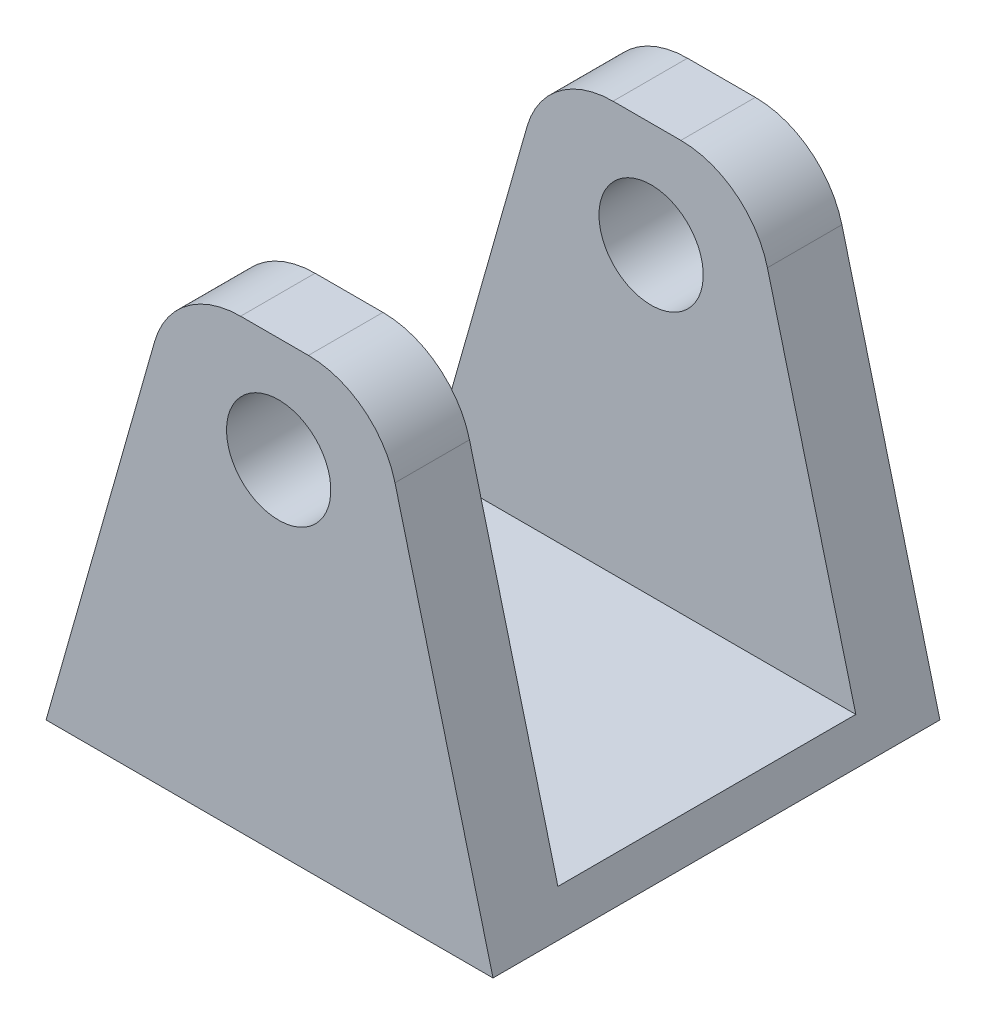
ISO-10303-21;
HEADER;
FILE_DESCRIPTION(('STEP AP214'),'2;1');
FILE_NAME('part.step','',(''),(''),'','','');
FILE_SCHEMA(('AUTOMOTIVE_DESIGN { 1 0 10303 214 1 1 1 1 }'));
ENDSEC;
DATA;
#1=APPLICATION_CONTEXT('core data for automotive mechanical design processes');
#2=APPLICATION_PROTOCOL_DEFINITION('international standard','automotive_design',2000,#1);
#3=PRODUCT_CONTEXT('',#1,'mechanical');
#4=PRODUCT('Part','Part','',(#3));
#5=PRODUCT_RELATED_PRODUCT_CATEGORY('part','',(#4));
#6=PRODUCT_DEFINITION_FORMATION('','',#4);
#7=PRODUCT_DEFINITION_CONTEXT('part definition',#1,'design');
#8=PRODUCT_DEFINITION('design','',#6,#7);
#9=PRODUCT_DEFINITION_SHAPE('','',#8);
#10=(LENGTH_UNIT() NAMED_UNIT(*) SI_UNIT(.MILLI.,.METRE.));
#11=(NAMED_UNIT(*) PLANE_ANGLE_UNIT() SI_UNIT($,.RADIAN.));
#12=(NAMED_UNIT(*) SI_UNIT($,.STERADIAN.) SOLID_ANGLE_UNIT());
#13=UNCERTAINTY_MEASURE_WITH_UNIT(LENGTH_MEASURE(1.E-05),#10,'distance_accuracy_value','');
#14=(GEOMETRIC_REPRESENTATION_CONTEXT(3) GLOBAL_UNCERTAINTY_ASSIGNED_CONTEXT((#13)) GLOBAL_UNIT_ASSIGNED_CONTEXT((#10,
#11,#12)) REPRESENTATION_CONTEXT('',''));
#15=CARTESIAN_POINT('',(0.,0.,0.));
#16=DIRECTION('',(0.,0.,1.));
#17=DIRECTION('',(1.,0.,0.));
#18=AXIS2_PLACEMENT_3D('',#15,#16,#17);
#19=CARTESIAN_POINT('',(-14.7779533941251,41.3214103307345,60.));
#20=DIRECTION('',(0.,0.,-1.));
#21=DIRECTION('',(-1.,0.,0.));
#22=AXIS2_PLACEMENT_3D('',#19,#20,#21);
#23=CYLINDRICAL_SURFACE('',#22,12.);
#24=DIRECTION('',(0.,0.,-1.));
#25=VECTOR('',#24,1.);
#26=CARTESIAN_POINT('',(-14.7779533941251,53.3214103307345,60.));
#27=LINE('',#26,#25);
#28=CARTESIAN_POINT('',(-14.7779533941251,53.3214103307345,9.99999999999999));
#29=VERTEX_POINT('',#28);
#30=CARTESIAN_POINT('',(-14.7779533941251,53.3214103307345,0.));
#31=VERTEX_POINT('',#30);
#32=EDGE_CURVE('E156',#29,#31,#27,.T.);
#33=ORIENTED_EDGE('',*,*,#32,.F.);
#34=CARTESIAN_POINT('',(-14.7779533941251,41.3214103307345,9.99999999999999));
#35=DIRECTION('',(0.,0.,-1.));
#36=DIRECTION('',(0.,1.,0.));
#37=AXIS2_PLACEMENT_3D('',#34,#35,#36);
#38=CIRCLE('',#37,12.);
#39=CARTESIAN_POINT('',(-3.15849944270205,44.3194580072666,9.99999999999999));
#40=VERTEX_POINT('',#39);
#41=EDGE_CURVE('E213',#29,#40,#38,.T.);
#42=ORIENTED_EDGE('',*,*,#41,.T.);
#43=DIRECTION('',(0.,0.,-1.));
#44=VECTOR('',#43,1.);
#45=CARTESIAN_POINT('',(-3.15849944270205,44.3194580072666,60.));
#46=LINE('',#45,#44);
#47=CARTESIAN_POINT('',(-3.15849944270205,44.3194580072666,0.));
#48=VERTEX_POINT('',#47);
#49=EDGE_CURVE('E160',#40,#48,#46,.T.);
#50=ORIENTED_EDGE('',*,*,#49,.T.);
#51=CARTESIAN_POINT('',(-14.7779533941251,41.3214103307345,0.));
#52=DIRECTION('',(0.,0.,1.));
#53=DIRECTION('',(-1.,0.,0.));
#54=AXIS2_PLACEMENT_3D('',#51,#52,#53);
#55=CIRCLE('',#54,12.);
#56=EDGE_CURVE('E138',#48,#31,#55,.T.);
#57=ORIENTED_EDGE('',*,*,#56,.T.);
#58=EDGE_LOOP('',(#33,#42,#50,#57));
#59=FACE_BOUND('',#58,.T.);
#60=ADVANCED_FACE('F33',(#59),#23,.T.);
#61=CARTESIAN_POINT('',(-14.7779533941251,53.3214103307345,60.));
#62=DIRECTION('',(0.,-1.,0.));
#63=DIRECTION('',(1.,0.,0.));
#64=AXIS2_PLACEMENT_3D('',#61,#62,#63);
#65=PLANE('',#64);
#66=DIRECTION('',(0.,0.,-1.));
#67=VECTOR('',#66,1.);
#68=CARTESIAN_POINT('',(-23.887487956644,53.3214103307345,60.));
#69=LINE('',#68,#67);
#70=CARTESIAN_POINT('',(-23.887487956644,53.3214103307345,10.));
#71=VERTEX_POINT('',#70);
#72=CARTESIAN_POINT('',(-23.887487956644,53.3214103307345,0.));
#73=VERTEX_POINT('',#72);
#74=EDGE_CURVE('E124',#71,#73,#69,.T.);
#75=ORIENTED_EDGE('',*,*,#74,.F.);
#76=DIRECTION('',(1.,0.,0.));
#77=VECTOR('',#76,1.);
#78=CARTESIAN_POINT('',(-14.7779533941251,53.3214103307345,9.99999999999999));
#79=LINE('',#78,#77);
#80=EDGE_CURVE('E210',#71,#29,#79,.T.);
#81=ORIENTED_EDGE('',*,*,#80,.T.);
#82=ORIENTED_EDGE('',*,*,#32,.T.);
#83=DIRECTION('',(-1.,0.,0.));
#84=VECTOR('',#83,1.);
#85=CARTESIAN_POINT('',(-14.7779533941251,53.3214103307345,0.));
#86=LINE('',#85,#84);
#87=EDGE_CURVE('E142',#31,#73,#86,.T.);
#88=ORIENTED_EDGE('',*,*,#87,.T.);
#89=EDGE_LOOP('',(#75,#81,#82,#88));
#90=FACE_BOUND('',#89,.T.);
#91=ADVANCED_FACE('F262',(#90),#65,.F.);
#92=CARTESIAN_POINT('',(-23.887487956644,41.3214103307345,60.));
#93=DIRECTION('',(0.,0.,-1.));
#94=DIRECTION('',(-1.,0.,0.));
#95=AXIS2_PLACEMENT_3D('',#92,#93,#94);
#96=CYLINDRICAL_SURFACE('',#95,12.);
#97=DIRECTION('',(0.,0.,-1.));
#98=VECTOR('',#97,1.);
#99=CARTESIAN_POINT('',(-35.4306354549265,44.6010057071331,60.));
#100=LINE('',#99,#98);
#101=CARTESIAN_POINT('',(-35.4306354549265,44.6010057071331,9.99999999999999));
#102=VERTEX_POINT('',#101);
#103=CARTESIAN_POINT('',(-35.4306354549265,44.6010057071331,0.));
#104=VERTEX_POINT('',#103);
#105=EDGE_CURVE('E125',#102,#104,#100,.T.);
#106=ORIENTED_EDGE('',*,*,#105,.F.);
#107=CARTESIAN_POINT('',(-23.887487956644,41.3214103307345,9.99999999999999));
#108=DIRECTION('',(0.,0.,-1.));
#109=DIRECTION('',(0.,1.,0.));
#110=AXIS2_PLACEMENT_3D('',#107,#108,#109);
#111=CIRCLE('',#110,12.);
#112=EDGE_CURVE('E207',#102,#71,#111,.T.);
#113=ORIENTED_EDGE('',*,*,#112,.T.);
#114=ORIENTED_EDGE('',*,*,#74,.T.);
#115=CARTESIAN_POINT('',(-23.887487956644,41.3214103307345,0.));
#116=DIRECTION('',(0.,0.,1.));
#117=DIRECTION('',(1.,0.,0.));
#118=AXIS2_PLACEMENT_3D('',#115,#116,#117);
#119=CIRCLE('',#118,12.);
#120=EDGE_CURVE('E145',#73,#104,#119,.T.);
#121=ORIENTED_EDGE('',*,*,#120,.T.);
#122=EDGE_LOOP('',(#106,#113,#114,#121));
#123=FACE_BOUND('',#122,.T.);
#124=ADVANCED_FACE('F264',(#123),#96,.T.);
#125=CARTESIAN_POINT('',(-18.7763510848294,39.1607245698293,60.));
#126=DIRECTION('',(0.,0.,-1.));
#127=DIRECTION('',(-1.,0.,0.));
#128=AXIS2_PLACEMENT_3D('',#125,#126,#127);
#129=CYLINDRICAL_SURFACE('',#128,7.);
#130=CARTESIAN_POINT('',(-18.7763510848294,39.1607245698293,9.99999999999999));
#131=DIRECTION('',(0.,0.,-1.));
#132=DIRECTION('',(0.,1.,0.));
#133=AXIS2_PLACEMENT_3D('',#130,#131,#132);
#134=CIRCLE('',#133,7.);
#135=CARTESIAN_POINT('',(-25.7763510848294,39.1607245698293,9.99999999999999));
#136=VERTEX_POINT('',#135);
#137=EDGE_CURVE('E168',#136,#136,#134,.T.);
#138=CARTESIAN_POINT('',(-18.7763510848294,39.1607245698293,0.));
#139=DIRECTION('',(0.,0.,1.));
#140=DIRECTION('',(1.,0.,0.));
#141=AXIS2_PLACEMENT_3D('',#138,#139,#140);
#142=CIRCLE('',#141,7.);
#143=CARTESIAN_POINT('',(-25.7763510848294,39.1607245698293,0.));
#144=VERTEX_POINT('',#143);
#145=EDGE_CURVE('E219',#144,#144,#142,.T.);
#146=CARTESIAN_POINT('',(-25.7763510848294,39.1607245698293,9.99999999999999));
#147=CARTESIAN_POINT('',(-25.7763510848294,39.1607245698293,9.89583333333333));
#148=CARTESIAN_POINT('',(-25.7763510848294,39.1607245698293,9.79166666666666));
#149=CARTESIAN_POINT('',(-25.7763510848294,39.1607245698293,9.58333333333333));
#150=CARTESIAN_POINT('',(-25.7763510848294,39.1607245698293,9.47916666666666));
#151=CARTESIAN_POINT('',(-25.7763510848294,39.1607245698293,9.27083333333333));
#152=CARTESIAN_POINT('',(-25.7763510848294,39.1607245698293,9.16666666666666));
#153=CARTESIAN_POINT('',(-25.7763510848294,39.1607245698293,8.95833333333333));
#154=CARTESIAN_POINT('',(-25.7763510848294,39.1607245698293,8.85416666666666));
#155=CARTESIAN_POINT('',(-25.7763510848294,39.1607245698293,8.64583333333333));
#156=CARTESIAN_POINT('',(-25.7763510848294,39.1607245698293,8.54166666666666));
#157=CARTESIAN_POINT('',(-25.7763510848294,39.1607245698293,8.33333333333333));
#158=CARTESIAN_POINT('',(-25.7763510848294,39.1607245698293,8.22916666666666));
#159=CARTESIAN_POINT('',(-25.7763510848294,39.1607245698293,8.02083333333333));
#160=CARTESIAN_POINT('',(-25.7763510848294,39.1607245698293,7.91666666666666));
#161=CARTESIAN_POINT('',(-25.7763510848294,39.1607245698293,7.70833333333333));
#162=CARTESIAN_POINT('',(-25.7763510848294,39.1607245698293,7.60416666666666));
#163=CARTESIAN_POINT('',(-25.7763510848294,39.1607245698293,7.39583333333333));
#164=CARTESIAN_POINT('',(-25.7763510848294,39.1607245698293,7.29166666666666));
#165=CARTESIAN_POINT('',(-25.7763510848294,39.1607245698293,7.08333333333333));
#166=CARTESIAN_POINT('',(-25.7763510848294,39.1607245698293,6.97916666666667));
#167=CARTESIAN_POINT('',(-25.7763510848294,39.1607245698293,6.77083333333333));
#168=CARTESIAN_POINT('',(-25.7763510848294,39.1607245698293,6.66666666666667));
#169=CARTESIAN_POINT('',(-25.7763510848294,39.1607245698293,6.45833333333333));
#170=CARTESIAN_POINT('',(-25.7763510848294,39.1607245698293,6.35416666666667));
#171=CARTESIAN_POINT('',(-25.7763510848294,39.1607245698293,6.14583333333333));
#172=CARTESIAN_POINT('',(-25.7763510848294,39.1607245698293,6.04166666666667));
#173=CARTESIAN_POINT('',(-25.7763510848294,39.1607245698293,5.83333333333333));
#174=CARTESIAN_POINT('',(-25.7763510848294,39.1607245698293,5.72916666666666));
#175=CARTESIAN_POINT('',(-25.7763510848294,39.1607245698293,5.52083333333333));
#176=CARTESIAN_POINT('',(-25.7763510848294,39.1607245698293,5.41666666666666));
#177=CARTESIAN_POINT('',(-25.7763510848294,39.1607245698293,5.20833333333333));
#178=CARTESIAN_POINT('',(-25.7763510848294,39.1607245698293,5.10416666666666));
#179=CARTESIAN_POINT('',(-25.7763510848294,39.1607245698293,4.89583333333333));
#180=CARTESIAN_POINT('',(-25.7763510848294,39.1607245698293,4.79166666666666));
#181=CARTESIAN_POINT('',(-25.7763510848294,39.1607245698293,4.58333333333333));
#182=CARTESIAN_POINT('',(-25.7763510848294,39.1607245698293,4.47916666666666));
#183=CARTESIAN_POINT('',(-25.7763510848294,39.1607245698293,4.27083333333333));
#184=CARTESIAN_POINT('',(-25.7763510848294,39.1607245698293,4.16666666666666));
#185=CARTESIAN_POINT('',(-25.7763510848294,39.1607245698293,3.95833333333333));
#186=CARTESIAN_POINT('',(-25.7763510848294,39.1607245698293,3.85416666666666));
#187=CARTESIAN_POINT('',(-25.7763510848294,39.1607245698293,3.64583333333333));
#188=CARTESIAN_POINT('',(-25.7763510848294,39.1607245698293,3.54166666666666));
#189=CARTESIAN_POINT('',(-25.7763510848294,39.1607245698293,3.33333333333333));
#190=CARTESIAN_POINT('',(-25.7763510848294,39.1607245698293,3.22916666666666));
#191=CARTESIAN_POINT('',(-25.7763510848294,39.1607245698293,3.02083333333333));
#192=CARTESIAN_POINT('',(-25.7763510848294,39.1607245698293,2.91666666666666));
#193=CARTESIAN_POINT('',(-25.7763510848294,39.1607245698293,2.70833333333333));
#194=CARTESIAN_POINT('',(-25.7763510848294,39.1607245698293,2.60416666666667));
#195=CARTESIAN_POINT('',(-25.7763510848294,39.1607245698293,2.39583333333333));
#196=CARTESIAN_POINT('',(-25.7763510848294,39.1607245698293,2.29166666666666));
#197=CARTESIAN_POINT('',(-25.7763510848294,39.1607245698293,2.08333333333333));
#198=CARTESIAN_POINT('',(-25.7763510848294,39.1607245698293,1.97916666666667));
#199=CARTESIAN_POINT('',(-25.7763510848294,39.1607245698293,1.77083333333334));
#200=CARTESIAN_POINT('',(-25.7763510848294,39.1607245698293,1.66666666666667));
#201=CARTESIAN_POINT('',(-25.7763510848294,39.1607245698293,1.45833333333333));
#202=CARTESIAN_POINT('',(-25.7763510848294,39.1607245698293,1.35416666666667));
#203=CARTESIAN_POINT('',(-25.7763510848294,39.1607245698293,1.14583333333333));
#204=CARTESIAN_POINT('',(-25.7763510848294,39.1607245698293,1.04166666666667));
#205=CARTESIAN_POINT('',(-25.7763510848294,39.1607245698293,0.833333333333334));
#206=CARTESIAN_POINT('',(-25.7763510848294,39.1607245698293,0.729166666666667));
#207=CARTESIAN_POINT('',(-25.7763510848294,39.1607245698293,0.520833333333334));
#208=CARTESIAN_POINT('',(-25.7763510848294,39.1607245698293,0.416666666666667));
#209=CARTESIAN_POINT('',(-25.7763510848294,39.1607245698293,0.208333333333334));
#210=CARTESIAN_POINT('',(-25.7763510848294,39.1607245698293,0.104166666666667));
#211=CARTESIAN_POINT('',(-25.7763510848294,39.1607245698293,0.));
#212=B_SPLINE_CURVE_WITH_KNOTS('',3,(#146,#147,#148,#149,#150,#151,#152,#153,#154,#155,#156,
#157,#158,#159,#160,#161,#162,#163,#164,#165,#166,#167,#168,#169,#170,#171,#172,#173,#174,#175,
#176,#177,#178,#179,#180,#181,#182,#183,#184,#185,#186,#187,#188,#189,#190,#191,#192,#193,#194,
#195,#196,#197,#198,#199,#200,#201,#202,#203,#204,#205,#206,#207,#208,#209,#210,#211),
.UNSPECIFIED.,.F.,.F.,(4,2,2,2,2,2,2,2,2,2,2,2,2,2,2,2,2,2,2,2,2,2,2,2,2,2,2,2,2,2,2,2,4),(0.,
0.3125,0.625000000000001,0.937500000000001,1.25,1.5625,1.875,2.1875,2.5,2.8125,3.125,3.4375,
3.75,4.0625,4.375,4.6875,5.,5.3125,5.625,5.9375,6.25,6.5625,6.875,7.1875,7.49999999999999,
7.8125,8.12499999999999,8.43749999999999,8.74999999999999,9.06249999999999,9.37499999999999,
9.68749999999999,9.99999999999999),.UNSPECIFIED.);
#213=EDGE_CURVE('BSEAM298',#136,#144,#212,.T.);
#214=ORIENTED_EDGE('',*,*,#137,.F.);
#215=ORIENTED_EDGE('',*,*,#145,.F.);
#216=ORIENTED_EDGE('',*,*,#213,.T.);
#217=ORIENTED_EDGE('',*,*,#213,.F.);
#218=EDGE_LOOP('',(#214,#216,#215,#217));
#219=FACE_BOUND('',#218,.T.);
#220=ADVANCED_FACE('F298',(#219),#129,.F.);
#221=CARTESIAN_POINT('',(-14.7779533941251,41.3214103307345,60.));
#222=DIRECTION('',(0.,0.,-1.));
#223=DIRECTION('',(-1.,0.,0.));
#224=AXIS2_PLACEMENT_3D('',#221,#222,#223);
#225=PLANE('',#224);
#226=DIRECTION('',(-0.249837306377678,0.968287829285252,0.));
#227=VECTOR('',#226,1.);
#228=CARTESIAN_POINT('',(9.99999999999999,-6.67858966926551,60.));
#229=LINE('',#228,#227);
#230=CARTESIAN_POINT('',(9.99999999999999,-6.67858966926551,60.));
#231=VERTEX_POINT('',#230);
#232=CARTESIAN_POINT('',(-3.15849944270205,44.3194580072666,60.));
#233=VERTEX_POINT('',#232);
#234=EDGE_CURVE('E151',#231,#233,#229,.T.);
#235=ORIENTED_EDGE('',*,*,#234,.T.);
#236=CARTESIAN_POINT('',(-14.7779533941251,41.3214103307345,60.));
#237=DIRECTION('',(0.,0.,1.));
#238=DIRECTION('',(-1.,0.,0.));
#239=AXIS2_PLACEMENT_3D('',#236,#237,#238);
#240=CIRCLE('',#239,12.);
#241=CARTESIAN_POINT('',(-14.7779533941251,53.3214103307345,60.));
#242=VERTEX_POINT('',#241);
#243=EDGE_CURVE('E93',#233,#242,#240,.T.);
#244=ORIENTED_EDGE('',*,*,#243,.T.);
#245=DIRECTION('',(-1.,0.,0.));
#246=VECTOR('',#245,1.);
#247=CARTESIAN_POINT('',(-14.7779533941251,53.3214103307345,60.));
#248=LINE('',#247,#246);
#249=CARTESIAN_POINT('',(-23.887487956644,53.3214103307345,60.));
#250=VERTEX_POINT('',#249);
#251=EDGE_CURVE('E110',#242,#250,#248,.T.);
#252=ORIENTED_EDGE('',*,*,#251,.T.);
#253=CARTESIAN_POINT('',(-23.887487956644,41.3214103307345,60.));
#254=DIRECTION('',(0.,0.,1.));
#255=DIRECTION('',(1.,0.,0.));
#256=AXIS2_PLACEMENT_3D('',#253,#254,#255);
#257=CIRCLE('',#256,12.);
#258=CARTESIAN_POINT('',(-35.4306354549265,44.6010057071331,60.));
#259=VERTEX_POINT('',#258);
#260=EDGE_CURVE('E102',#250,#259,#257,.T.);
#261=ORIENTED_EDGE('',*,*,#260,.T.);
#262=DIRECTION('',(-0.273299614699888,-0.961928958190205,0.));
#263=VECTOR('',#262,1.);
#264=CARTESIAN_POINT('',(-50.,-6.67858966926552,60.));
#265=LINE('',#264,#263);
#266=CARTESIAN_POINT('',(-50.,-6.67858966926552,60.));
#267=VERTEX_POINT('',#266);
#268=EDGE_CURVE('E107',#259,#267,#265,.T.);
#269=ORIENTED_EDGE('',*,*,#268,.T.);
#270=DIRECTION('',(1.,0.,0.));
#271=VECTOR('',#270,1.);
#272=CARTESIAN_POINT('',(9.99999999999999,-6.67858966926551,60.));
#273=LINE('',#272,#271);
#274=EDGE_CURVE('E57',#267,#231,#273,.T.);
#275=ORIENTED_EDGE('',*,*,#274,.T.);
#276=EDGE_LOOP('',(#235,#244,#252,#261,#269,#275));
#277=FACE_BOUND('',#276,.T.);
#278=CARTESIAN_POINT('',(-18.7763510848294,39.1607245698293,60.));
#279=DIRECTION('',(0.,0.,1.));
#280=DIRECTION('',(1.,0.,0.));
#281=AXIS2_PLACEMENT_3D('',#278,#279,#280);
#282=CIRCLE('',#281,7.);
#283=CARTESIAN_POINT('',(-25.7763510848294,39.1607245698293,60.));
#284=VERTEX_POINT('',#283);
#285=EDGE_CURVE('E139',#284,#284,#282,.T.);
#286=ORIENTED_EDGE('',*,*,#285,.F.);
#287=EDGE_LOOP('',(#286));
#288=FACE_BOUND('',#287,.T.);
#289=ADVANCED_FACE('F104',(#277,#288),#225,.F.);
#290=CARTESIAN_POINT('',(-14.7779533941251,41.3214103307345,0.));
#291=DIRECTION('',(0.,0.,-1.));
#292=DIRECTION('',(-1.,0.,0.));
#293=AXIS2_PLACEMENT_3D('',#290,#291,#292);
#294=PLANE('',#293);
#295=DIRECTION('',(-0.249837306377678,0.968287829285252,0.));
#296=VECTOR('',#295,1.);
#297=CARTESIAN_POINT('',(9.99999999999999,-6.67858966926551,0.));
#298=LINE('',#297,#296);
#299=CARTESIAN_POINT('',(9.99999999999999,-6.67858966926551,0.));
#300=VERTEX_POINT('',#299);
#301=EDGE_CURVE('E135',#300,#48,#298,.T.);
#302=ORIENTED_EDGE('',*,*,#301,.F.);
#303=DIRECTION('',(1.,0.,0.));
#304=VECTOR('',#303,1.);
#305=CARTESIAN_POINT('',(9.99999999999999,-6.67858966926551,0.));
#306=LINE('',#305,#304);
#307=CARTESIAN_POINT('',(-50.,-6.67858966926552,0.));
#308=VERTEX_POINT('',#307);
#309=EDGE_CURVE('E84',#308,#300,#306,.T.);
#310=ORIENTED_EDGE('',*,*,#309,.F.);
#311=DIRECTION('',(-0.273299614699888,-0.961928958190205,0.));
#312=VECTOR('',#311,1.);
#313=CARTESIAN_POINT('',(-50.,-6.67858966926552,0.));
#314=LINE('',#313,#312);
#315=EDGE_CURVE('E148',#104,#308,#314,.T.);
#316=ORIENTED_EDGE('',*,*,#315,.F.);
#317=ORIENTED_EDGE('',*,*,#120,.F.);
#318=ORIENTED_EDGE('',*,*,#87,.F.);
#319=ORIENTED_EDGE('',*,*,#56,.F.);
#320=EDGE_LOOP('',(#302,#310,#316,#317,#318,#319));
#321=FACE_BOUND('',#320,.T.);
#322=ORIENTED_EDGE('',*,*,#145,.T.);
#323=EDGE_LOOP('',(#322));
#324=FACE_BOUND('',#323,.T.);
#325=ADVANCED_FACE('F255',(#321,#324),#294,.T.);
#326=CARTESIAN_POINT('',(9.99999999999999,-6.67858966926551,60.));
#327=DIRECTION('',(-0.968287829285253,-0.249837306377678,0.));
#328=DIRECTION('',(0.249837306377678,-0.968287829285253,0.));
#329=AXIS2_PLACEMENT_3D('',#326,#327,#328);
#330=PLANE('',#329);
#331=ORIENTED_EDGE('',*,*,#49,.F.);
#332=DIRECTION('',(0.249837306377678,-0.968287829285253,0.));
#333=VECTOR('',#332,1.);
#334=CARTESIAN_POINT('',(9.99999999999999,-6.6785896692655,9.99999999999999));
#335=LINE('',#334,#333);
#336=CARTESIAN_POINT('',(8.70990164896476,-1.67858966926551,9.99999999999999));
#337=VERTEX_POINT('',#336);
#338=EDGE_CURVE('E216',#40,#337,#335,.T.);
#339=ORIENTED_EDGE('',*,*,#338,.T.);
#340=DIRECTION('',(0.,0.,1.));
#341=VECTOR('',#340,1.);
#342=CARTESIAN_POINT('',(8.70990164896476,-1.67858966926551,60.));
#343=LINE('',#342,#341);
#344=CARTESIAN_POINT('',(8.70990164896475,-1.67858966926551,50.));
#345=VERTEX_POINT('',#344);
#346=EDGE_CURVE('E187',#337,#345,#343,.T.);
#347=ORIENTED_EDGE('',*,*,#346,.T.);
#348=DIRECTION('',(-0.249837306377678,0.968287829285253,0.));
#349=VECTOR('',#348,1.);
#350=CARTESIAN_POINT('',(9.99999999999999,-6.67858966926551,50.));
#351=LINE('',#350,#349);
#352=CARTESIAN_POINT('',(-3.15849944270205,44.3194580072666,50.));
#353=VERTEX_POINT('',#352);
#354=EDGE_CURVE('E171',#345,#353,#351,.T.);
#355=ORIENTED_EDGE('',*,*,#354,.T.);
#356=EDGE_CURVE('E161',#233,#353,#46,.T.);
#357=ORIENTED_EDGE('',*,*,#356,.F.);
#358=ORIENTED_EDGE('',*,*,#234,.F.);
#359=DIRECTION('',(0.,0.,-1.));
#360=VECTOR('',#359,1.);
#361=CARTESIAN_POINT('',(9.99999999999999,-6.67858966926551,60.));
#362=LINE('',#361,#360);
#363=EDGE_CURVE('E131',#231,#300,#362,.T.);
#364=ORIENTED_EDGE('',*,*,#363,.T.);
#365=ORIENTED_EDGE('',*,*,#301,.T.);
#366=EDGE_LOOP('',(#331,#339,#347,#355,#357,#358,#364,#365));
#367=FACE_BOUND('',#366,.T.);
#368=ADVANCED_FACE('F35',(#367),#330,.F.);
#369=ORIENTED_EDGE('',*,*,#356,.T.);
#370=CARTESIAN_POINT('',(-14.7779533941251,41.3214103307345,50.));
#371=DIRECTION('',(0.,0.,1.));
#372=DIRECTION('',(0.,-1.,0.));
#373=AXIS2_PLACEMENT_3D('',#370,#371,#372);
#374=CIRCLE('',#373,12.);
#375=CARTESIAN_POINT('',(-14.7779533941251,53.3214103307345,50.));
#376=VERTEX_POINT('',#375);
#377=EDGE_CURVE('E201',#353,#376,#374,.T.);
#378=ORIENTED_EDGE('',*,*,#377,.T.);
#379=EDGE_CURVE('E157',#242,#376,#27,.T.);
#380=ORIENTED_EDGE('',*,*,#379,.F.);
#381=ORIENTED_EDGE('',*,*,#243,.F.);
#382=EDGE_LOOP('',(#369,#378,#380,#381));
#383=FACE_BOUND('',#382,.T.);
#384=ADVANCED_FACE('F227',(#383),#23,.T.);
#385=ORIENTED_EDGE('',*,*,#379,.T.);
#386=DIRECTION('',(-1.,0.,0.));
#387=VECTOR('',#386,1.);
#388=CARTESIAN_POINT('',(-14.7779533941251,53.3214103307345,50.));
#389=LINE('',#388,#387);
#390=CARTESIAN_POINT('',(-23.887487956644,53.3214103307345,50.));
#391=VERTEX_POINT('',#390);
#392=EDGE_CURVE('E198',#376,#391,#389,.T.);
#393=ORIENTED_EDGE('',*,*,#392,.T.);
#394=EDGE_CURVE('E154',#250,#391,#69,.T.);
#395=ORIENTED_EDGE('',*,*,#394,.F.);
#396=ORIENTED_EDGE('',*,*,#251,.F.);
#397=EDGE_LOOP('',(#385,#393,#395,#396));
#398=FACE_BOUND('',#397,.T.);
#399=ADVANCED_FACE('F231',(#398),#65,.F.);
#400=ORIENTED_EDGE('',*,*,#394,.T.);
#401=CARTESIAN_POINT('',(-23.887487956644,41.3214103307345,50.));
#402=DIRECTION('',(0.,0.,1.));
#403=DIRECTION('',(0.,-1.,0.));
#404=AXIS2_PLACEMENT_3D('',#401,#402,#403);
#405=CIRCLE('',#404,12.);
#406=CARTESIAN_POINT('',(-35.4306354549265,44.6010057071331,50.));
#407=VERTEX_POINT('',#406);
#408=EDGE_CURVE('E121',#391,#407,#405,.T.);
#409=ORIENTED_EDGE('',*,*,#408,.T.);
#410=EDGE_CURVE('E117',#259,#407,#100,.T.);
#411=ORIENTED_EDGE('',*,*,#410,.F.);
#412=ORIENTED_EDGE('',*,*,#260,.F.);
#413=EDGE_LOOP('',(#400,#409,#411,#412));
#414=FACE_BOUND('',#413,.T.);
#415=ADVANCED_FACE('F118',(#414),#96,.T.);
#416=CARTESIAN_POINT('',(-50.,-6.67858966926552,60.));
#417=DIRECTION('',(0.961928958190205,-0.273299614699888,0.));
#418=DIRECTION('',(0.273299614699888,0.961928958190205,0.));
#419=AXIS2_PLACEMENT_3D('',#416,#417,#418);
#420=PLANE('',#419);
#421=DIRECTION('',(0.,0.,-1.));
#422=VECTOR('',#421,1.);
#423=CARTESIAN_POINT('',(-48.579418925,-1.67858966926551,60.));
#424=LINE('',#423,#422);
#425=CARTESIAN_POINT('',(-48.579418925,-1.67858966926551,50.));
#426=VERTEX_POINT('',#425);
#427=CARTESIAN_POINT('',(-48.579418925,-1.67858966926551,9.99999999999999));
#428=VERTEX_POINT('',#427);
#429=EDGE_CURVE('E41',#426,#428,#424,.T.);
#430=ORIENTED_EDGE('',*,*,#429,.T.);
#431=DIRECTION('',(0.273299614699888,0.961928958190205,0.));
#432=VECTOR('',#431,1.);
#433=CARTESIAN_POINT('',(-50.,-6.67858966926551,9.99999999999999));
#434=LINE('',#433,#432);
#435=EDGE_CURVE('E170',#428,#102,#434,.T.);
#436=ORIENTED_EDGE('',*,*,#435,.T.);
#437=ORIENTED_EDGE('',*,*,#105,.T.);
#438=ORIENTED_EDGE('',*,*,#315,.T.);
#439=DIRECTION('',(0.,0.,-1.));
#440=VECTOR('',#439,1.);
#441=CARTESIAN_POINT('',(-50.,-6.67858966926552,60.));
#442=LINE('',#441,#440);
#443=EDGE_CURVE('E129',#267,#308,#442,.T.);
#444=ORIENTED_EDGE('',*,*,#443,.F.);
#445=ORIENTED_EDGE('',*,*,#268,.F.);
#446=ORIENTED_EDGE('',*,*,#410,.T.);
#447=DIRECTION('',(-0.273299614699888,-0.961928958190205,0.));
#448=VECTOR('',#447,1.);
#449=CARTESIAN_POINT('',(-50.,-6.67858966926552,50.));
#450=LINE('',#449,#448);
#451=EDGE_CURVE('E166',#407,#426,#450,.T.);
#452=ORIENTED_EDGE('',*,*,#451,.T.);
#453=EDGE_LOOP('',(#430,#436,#437,#438,#444,#445,#446,#452));
#454=FACE_BOUND('',#453,.T.);
#455=ADVANCED_FACE('F128',(#454),#420,.F.);
#456=CARTESIAN_POINT('',(9.99999999999999,-6.67858966926551,60.));
#457=DIRECTION('',(0.,1.,0.));
#458=DIRECTION('',(-1.,0.,0.));
#459=AXIS2_PLACEMENT_3D('',#456,#457,#458);
#460=PLANE('',#459);
#461=CARTESIAN_POINT('',(-19.6100056534351,-6.67858966926551,29.1550122491098));
#462=DIRECTION('',(0.,1.,0.));
#463=DIRECTION('',(-1.,0.,0.));
#464=AXIS2_PLACEMENT_3D('',#461,#462,#463);
#465=CIRCLE('',#464,7.);
#466=CARTESIAN_POINT('',(-26.6100056534351,-6.67858966926551,29.1550122491098));
#467=VERTEX_POINT('',#466);
#468=EDGE_CURVE('E11',#467,#467,#465,.F.);
#469=ORIENTED_EDGE('',*,*,#468,.F.);
#470=EDGE_LOOP('',(#469));
#471=FACE_BOUND('',#470,.T.);
#472=ORIENTED_EDGE('',*,*,#309,.T.);
#473=ORIENTED_EDGE('',*,*,#363,.F.);
#474=ORIENTED_EDGE('',*,*,#274,.F.);
#475=ORIENTED_EDGE('',*,*,#443,.T.);
#476=EDGE_LOOP('',(#472,#473,#474,#475));
#477=FACE_BOUND('',#476,.T.);
#478=ADVANCED_FACE('F265',(#471,#477),#460,.F.);
#479=CARTESIAN_POINT('',(-18.7763510848294,39.1607245698293,50.));
#480=DIRECTION('',(0.,0.,1.));
#481=DIRECTION('',(0.,-1.,0.));
#482=AXIS2_PLACEMENT_3D('',#479,#480,#481);
#483=CIRCLE('',#482,7.);
#484=CARTESIAN_POINT('',(-25.7763510848294,39.1607245698293,50.));
#485=VERTEX_POINT('',#484);
#486=EDGE_CURVE('E163',#485,#485,#483,.T.);
#487=CARTESIAN_POINT('',(-25.7763510848294,39.1607245698293,50.));
#488=CARTESIAN_POINT('',(-25.7763510848294,39.1607245698293,50.1041666666667));
#489=CARTESIAN_POINT('',(-25.7763510848294,39.1607245698293,50.2083333333333));
#490=CARTESIAN_POINT('',(-25.7763510848294,39.1607245698293,50.4166666666667));
#491=CARTESIAN_POINT('',(-25.7763510848294,39.1607245698293,50.5208333333333));
#492=CARTESIAN_POINT('',(-25.7763510848294,39.1607245698293,50.7291666666667));
#493=CARTESIAN_POINT('',(-25.7763510848294,39.1607245698293,50.8333333333333));
#494=CARTESIAN_POINT('',(-25.7763510848294,39.1607245698293,51.0416666666667));
#495=CARTESIAN_POINT('',(-25.7763510848294,39.1607245698293,51.1458333333333));
#496=CARTESIAN_POINT('',(-25.7763510848294,39.1607245698293,51.3541666666667));
#497=CARTESIAN_POINT('',(-25.7763510848294,39.1607245698293,51.4583333333333));
#498=CARTESIAN_POINT('',(-25.7763510848294,39.1607245698293,51.6666666666667));
#499=CARTESIAN_POINT('',(-25.7763510848294,39.1607245698293,51.7708333333333));
#500=CARTESIAN_POINT('',(-25.7763510848294,39.1607245698293,51.9791666666667));
#501=CARTESIAN_POINT('',(-25.7763510848294,39.1607245698293,52.0833333333333));
#502=CARTESIAN_POINT('',(-25.7763510848294,39.1607245698293,52.2916666666667));
#503=CARTESIAN_POINT('',(-25.7763510848294,39.1607245698293,52.3958333333333));
#504=CARTESIAN_POINT('',(-25.7763510848294,39.1607245698293,52.6041666666667));
#505=CARTESIAN_POINT('',(-25.7763510848294,39.1607245698293,52.7083333333333));
#506=CARTESIAN_POINT('',(-25.7763510848294,39.1607245698293,52.9166666666667));
#507=CARTESIAN_POINT('',(-25.7763510848294,39.1607245698293,53.0208333333333));
#508=CARTESIAN_POINT('',(-25.7763510848294,39.1607245698293,53.2291666666667));
#509=CARTESIAN_POINT('',(-25.7763510848294,39.1607245698293,53.3333333333333));
#510=CARTESIAN_POINT('',(-25.7763510848294,39.1607245698293,53.5416666666667));
#511=CARTESIAN_POINT('',(-25.7763510848294,39.1607245698293,53.6458333333333));
#512=CARTESIAN_POINT('',(-25.7763510848294,39.1607245698293,53.8541666666667));
#513=CARTESIAN_POINT('',(-25.7763510848294,39.1607245698293,53.9583333333333));
#514=CARTESIAN_POINT('',(-25.7763510848294,39.1607245698293,54.1666666666667));
#515=CARTESIAN_POINT('',(-25.7763510848294,39.1607245698293,54.2708333333333));
#516=CARTESIAN_POINT('',(-25.7763510848294,39.1607245698293,54.4791666666667));
#517=CARTESIAN_POINT('',(-25.7763510848294,39.1607245698293,54.5833333333333));
#518=CARTESIAN_POINT('',(-25.7763510848294,39.1607245698293,54.7916666666667));
#519=CARTESIAN_POINT('',(-25.7763510848294,39.1607245698293,54.8958333333333));
#520=CARTESIAN_POINT('',(-25.7763510848294,39.1607245698293,55.1041666666667));
#521=CARTESIAN_POINT('',(-25.7763510848294,39.1607245698293,55.2083333333333));
#522=CARTESIAN_POINT('',(-25.7763510848294,39.1607245698293,55.4166666666667));
#523=CARTESIAN_POINT('',(-25.7763510848294,39.1607245698293,55.5208333333333));
#524=CARTESIAN_POINT('',(-25.7763510848294,39.1607245698293,55.7291666666667));
#525=CARTESIAN_POINT('',(-25.7763510848294,39.1607245698293,55.8333333333333));
#526=CARTESIAN_POINT('',(-25.7763510848294,39.1607245698293,56.0416666666667));
#527=CARTESIAN_POINT('',(-25.7763510848294,39.1607245698293,56.1458333333333));
#528=CARTESIAN_POINT('',(-25.7763510848294,39.1607245698293,56.3541666666667));
#529=CARTESIAN_POINT('',(-25.7763510848294,39.1607245698293,56.4583333333333));
#530=CARTESIAN_POINT('',(-25.7763510848294,39.1607245698293,56.6666666666667));
#531=CARTESIAN_POINT('',(-25.7763510848294,39.1607245698293,56.7708333333333));
#532=CARTESIAN_POINT('',(-25.7763510848294,39.1607245698293,56.9791666666667));
#533=CARTESIAN_POINT('',(-25.7763510848294,39.1607245698293,57.0833333333333));
#534=CARTESIAN_POINT('',(-25.7763510848294,39.1607245698293,57.2916666666667));
#535=CARTESIAN_POINT('',(-25.7763510848294,39.1607245698293,57.3958333333333));
#536=CARTESIAN_POINT('',(-25.7763510848294,39.1607245698293,57.6041666666667));
#537=CARTESIAN_POINT('',(-25.7763510848294,39.1607245698293,57.7083333333333));
#538=CARTESIAN_POINT('',(-25.7763510848294,39.1607245698293,57.9166666666667));
#539=CARTESIAN_POINT('',(-25.7763510848294,39.1607245698293,58.0208333333333));
#540=CARTESIAN_POINT('',(-25.7763510848294,39.1607245698293,58.2291666666667));
#541=CARTESIAN_POINT('',(-25.7763510848294,39.1607245698293,58.3333333333333));
#542=CARTESIAN_POINT('',(-25.7763510848294,39.1607245698293,58.5416666666667));
#543=CARTESIAN_POINT('',(-25.7763510848294,39.1607245698293,58.6458333333333));
#544=CARTESIAN_POINT('',(-25.7763510848294,39.1607245698293,58.8541666666667));
#545=CARTESIAN_POINT('',(-25.7763510848294,39.1607245698293,58.9583333333333));
#546=CARTESIAN_POINT('',(-25.7763510848294,39.1607245698293,59.1666666666667));
#547=CARTESIAN_POINT('',(-25.7763510848294,39.1607245698293,59.2708333333333));
#548=CARTESIAN_POINT('',(-25.7763510848294,39.1607245698293,59.4791666666667));
#549=CARTESIAN_POINT('',(-25.7763510848294,39.1607245698293,59.5833333333333));
#550=CARTESIAN_POINT('',(-25.7763510848294,39.1607245698293,59.7916666666667));
#551=CARTESIAN_POINT('',(-25.7763510848294,39.1607245698293,59.8958333333333));
#552=CARTESIAN_POINT('',(-25.7763510848294,39.1607245698293,60.));
#553=B_SPLINE_CURVE_WITH_KNOTS('',3,(#487,#488,#489,#490,#491,#492,#493,#494,#495,#496,#497,
#498,#499,#500,#501,#502,#503,#504,#505,#506,#507,#508,#509,#510,#511,#512,#513,#514,#515,#516,
#517,#518,#519,#520,#521,#522,#523,#524,#525,#526,#527,#528,#529,#530,#531,#532,#533,#534,#535,
#536,#537,#538,#539,#540,#541,#542,#543,#544,#545,#546,#547,#548,#549,#550,#551,#552),
.UNSPECIFIED.,.F.,.F.,(4,2,2,2,2,2,2,2,2,2,2,2,2,2,2,2,2,2,2,2,2,2,2,2,2,2,2,2,2,2,2,2,4),(0.,
0.3125,0.625000000000001,0.937500000000001,1.25,1.5625,1.875,2.1875,2.5,2.8125,3.125,3.4375,
3.75,4.0625,4.375,4.6875,5.,5.3125,5.62500000000001,5.93750000000001,6.25000000000001,
6.56250000000001,6.87500000000001,7.18750000000001,7.50000000000001,7.81250000000001,
8.12500000000001,8.43750000000001,8.75000000000001,9.06250000000001,9.37500000000001,
9.68750000000001,10.),.UNSPECIFIED.);
#554=EDGE_CURVE('BSEAM304',#485,#284,#553,.T.);
#555=ORIENTED_EDGE('',*,*,#486,.F.);
#556=ORIENTED_EDGE('',*,*,#285,.T.);
#557=ORIENTED_EDGE('',*,*,#554,.T.);
#558=ORIENTED_EDGE('',*,*,#554,.F.);
#559=EDGE_LOOP('',(#555,#557,#556,#558));
#560=FACE_BOUND('',#559,.T.);
#561=ADVANCED_FACE('F304',(#560),#129,.F.);
#562=CARTESIAN_POINT('',(-50.,-1.67858966926551,50.));
#563=DIRECTION('',(0.,-1.,0.));
#564=DIRECTION('',(0.,0.,-1.));
#565=AXIS2_PLACEMENT_3D('',#562,#563,#564);
#566=PLANE('',#565);
#567=DIRECTION('',(1.,0.,0.));
#568=VECTOR('',#567,1.);
#569=CARTESIAN_POINT('',(-50.,-1.67858966926551,9.99999999999999));
#570=LINE('',#569,#568);
#571=EDGE_CURVE('E167',#428,#337,#570,.T.);
#572=ORIENTED_EDGE('',*,*,#571,.F.);
#573=ORIENTED_EDGE('',*,*,#429,.F.);
#574=DIRECTION('',(1.,0.,0.));
#575=VECTOR('',#574,1.);
#576=CARTESIAN_POINT('',(-50.,-1.67858966926551,50.));
#577=LINE('',#576,#575);
#578=EDGE_CURVE('E48',#426,#345,#577,.T.);
#579=ORIENTED_EDGE('',*,*,#578,.T.);
#580=ORIENTED_EDGE('',*,*,#346,.F.);
#581=EDGE_LOOP('',(#572,#573,#579,#580));
#582=FACE_BOUND('',#581,.T.);
#583=ADVANCED_FACE('F182',(#582),#566,.F.);
#584=CARTESIAN_POINT('',(-50.,108.321410330734,10.));
#585=DIRECTION('',(0.,0.,-1.));
#586=DIRECTION('',(0.,1.,0.));
#587=AXIS2_PLACEMENT_3D('',#584,#585,#586);
#588=PLANE('',#587);
#589=ORIENTED_EDGE('',*,*,#137,.T.);
#590=EDGE_LOOP('',(#589));
#591=FACE_BOUND('',#590,.T.);
#592=ORIENTED_EDGE('',*,*,#41,.F.);
#593=ORIENTED_EDGE('',*,*,#80,.F.);
#594=ORIENTED_EDGE('',*,*,#112,.F.);
#595=ORIENTED_EDGE('',*,*,#435,.F.);
#596=ORIENTED_EDGE('',*,*,#571,.T.);
#597=ORIENTED_EDGE('',*,*,#338,.F.);
#598=EDGE_LOOP('',(#592,#593,#594,#595,#596,#597));
#599=FACE_BOUND('',#598,.T.);
#600=ADVANCED_FACE('F247',(#591,#599),#588,.F.);
#601=CARTESIAN_POINT('',(-50.,108.321410330734,50.));
#602=DIRECTION('',(0.,0.,1.));
#603=DIRECTION('',(0.,-1.,0.));
#604=AXIS2_PLACEMENT_3D('',#601,#602,#603);
#605=PLANE('',#604);
#606=ORIENTED_EDGE('',*,*,#486,.T.);
#607=EDGE_LOOP('',(#606));
#608=FACE_BOUND('',#607,.T.);
#609=ORIENTED_EDGE('',*,*,#578,.F.);
#610=ORIENTED_EDGE('',*,*,#451,.F.);
#611=ORIENTED_EDGE('',*,*,#408,.F.);
#612=ORIENTED_EDGE('',*,*,#392,.F.);
#613=ORIENTED_EDGE('',*,*,#377,.F.);
#614=ORIENTED_EDGE('',*,*,#354,.F.);
#615=EDGE_LOOP('',(#609,#610,#611,#612,#613,#614));
#616=FACE_BOUND('',#615,.T.);
#617=ADVANCED_FACE('F266',(#608,#616),#605,.F.);
#618=CARTESIAN_POINT('',(-19.6100056534351,-26.6785896692655,29.1550122491098));
#619=DIRECTION('',(0.,1.,0.));
#620=DIRECTION('',(-1.,0.,0.));
#621=AXIS2_PLACEMENT_3D('',#618,#619,#620);
#622=CYLINDRICAL_SURFACE('',#621,7.);
#623=CARTESIAN_POINT('',(-19.6100056534351,-26.6785896692655,29.1550122491098));
#624=DIRECTION('',(0.,-1.,0.));
#625=DIRECTION('',(1.,0.,0.));
#626=AXIS2_PLACEMENT_3D('',#623,#624,#625);
#627=CIRCLE('',#626,7.);
#628=CARTESIAN_POINT('',(-12.6100056534351,-26.6785896692655,29.1550122491098));
#629=VERTEX_POINT('',#628);
#630=EDGE_CURVE('E192',#629,#629,#627,.T.);
#631=ORIENTED_EDGE('',*,*,#630,.F.);
#632=EDGE_LOOP('',(#631));
#633=FACE_BOUND('',#632,.T.);
#634=ORIENTED_EDGE('',*,*,#468,.T.);
#635=EDGE_LOOP('',(#634));
#636=FACE_BOUND('',#635,.T.);
#637=ADVANCED_FACE('F268',(#633,#636),#622,.T.);
#638=CARTESIAN_POINT('',(-19.6100056534351,-26.6785896692655,29.1550122491098));
#639=DIRECTION('',(0.,-1.,0.));
#640=DIRECTION('',(1.,0.,0.));
#641=AXIS2_PLACEMENT_3D('',#638,#639,#640);
#642=PLANE('',#641);
#643=ORIENTED_EDGE('',*,*,#630,.T.);
#644=EDGE_LOOP('',(#643));
#645=FACE_BOUND('',#644,.T.);
#646=ADVANCED_FACE('F275',(#645),#642,.T.);
#647=CLOSED_SHELL('',(#60,#91,#124,#220,#289,#325,#368,#384,#399,#415,#455,#478,#561,#583,#600,
#617,#637,#646));
#648=MANIFOLD_SOLID_BREP('B2',#647);
#649=ADVANCED_BREP_SHAPE_REPRESENTATION('',(#18,#648),#14);
#650=SHAPE_DEFINITION_REPRESENTATION(#9,#649);
ENDSEC;
END-ISO-10303-21;
